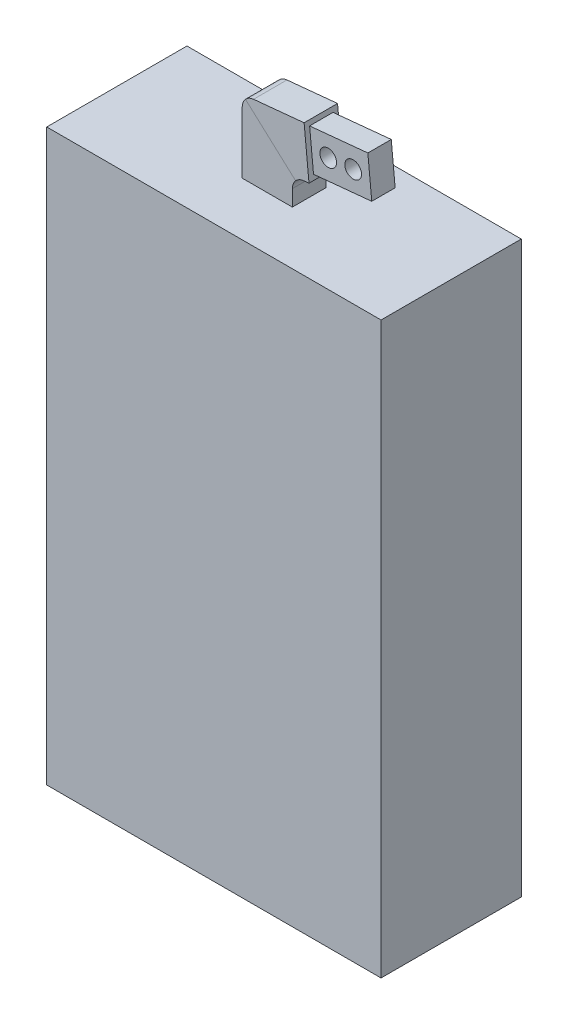
ISO-10303-21;
HEADER;
FILE_DESCRIPTION(('STEP AP214'),'2;1');
FILE_NAME('part.step','',(''),(''),'','','');
FILE_SCHEMA(('AUTOMOTIVE_DESIGN { 1 0 10303 214 1 1 1 1 }'));
ENDSEC;
DATA;
#1=APPLICATION_CONTEXT('core data for automotive mechanical design processes');
#2=APPLICATION_PROTOCOL_DEFINITION('international standard','automotive_design',2000,#1);
#3=PRODUCT_CONTEXT('',#1,'mechanical');
#4=PRODUCT('Part','Part','',(#3));
#5=PRODUCT_RELATED_PRODUCT_CATEGORY('part','',(#4));
#6=PRODUCT_DEFINITION_FORMATION('','',#4);
#7=PRODUCT_DEFINITION_CONTEXT('part definition',#1,'design');
#8=PRODUCT_DEFINITION('design','',#6,#7);
#9=PRODUCT_DEFINITION_SHAPE('','',#8);
#10=(LENGTH_UNIT() NAMED_UNIT(*) SI_UNIT(.MILLI.,.METRE.));
#11=(NAMED_UNIT(*) PLANE_ANGLE_UNIT() SI_UNIT($,.RADIAN.));
#12=(NAMED_UNIT(*) SI_UNIT($,.STERADIAN.) SOLID_ANGLE_UNIT());
#13=UNCERTAINTY_MEASURE_WITH_UNIT(LENGTH_MEASURE(1.E-05),#10,'distance_accuracy_value','');
#14=(GEOMETRIC_REPRESENTATION_CONTEXT(3) GLOBAL_UNCERTAINTY_ASSIGNED_CONTEXT((#13)) GLOBAL_UNIT_ASSIGNED_CONTEXT((#10,
#11,#12)) REPRESENTATION_CONTEXT('',''));
#15=CARTESIAN_POINT('',(0.,0.,0.));
#16=DIRECTION('',(0.,0.,1.));
#17=DIRECTION('',(1.,0.,0.));
#18=AXIS2_PLACEMENT_3D('',#15,#16,#17);
#19=CARTESIAN_POINT('',(-13.5365598552555,13.6060584518054,10.));
#20=DIRECTION('',(0.0972370244448278,-0.995261252675455,0.));
#21=DIRECTION('',(0.995261252675455,0.0972370244448278,0.));
#22=AXIS2_PLACEMENT_3D('',#19,#20,#21);
#23=PLANE('',#22);
#24=DIRECTION('',(0.995261252675455,0.0972370244448278,0.));
#25=VECTOR('',#24,1.);
#26=CARTESIAN_POINT('',(-13.5365598552555,13.6060584518054,10.));
#27=LINE('',#26,#25);
#28=CARTESIAN_POINT('',(21.7707223166638,17.0555799220749,10.));
#29=VERTEX_POINT('',#28);
#30=CARTESIAN_POINT('',(24.9526125280876,17.3664505959179,10.));
#31=VERTEX_POINT('',#30);
#32=EDGE_CURVE('E229',#29,#31,#27,.T.);
#33=ORIENTED_EDGE('',*,*,#32,.F.);
#34=DIRECTION('',(0.,0.,1.));
#35=VECTOR('',#34,1.);
#36=CARTESIAN_POINT('',(21.7707223166638,17.0555799220749,-10.));
#37=LINE('',#36,#35);
#38=CARTESIAN_POINT('',(21.7707223166638,17.0555799220749,-10.));
#39=VERTEX_POINT('',#38);
#40=EDGE_CURVE('E295',#29,#39,#37,.F.);
#41=ORIENTED_EDGE('',*,*,#40,.T.);
#42=DIRECTION('',(0.995261252675455,0.0972370244448278,0.));
#43=VECTOR('',#42,1.);
#44=CARTESIAN_POINT('',(-13.5365598552555,13.6060584518054,-10.));
#45=LINE('',#44,#43);
#46=CARTESIAN_POINT('',(24.9526125280876,17.3664505959179,-10.));
#47=VERTEX_POINT('',#46);
#48=EDGE_CURVE('E252',#39,#47,#45,.T.);
#49=ORIENTED_EDGE('',*,*,#48,.T.);
#50=DIRECTION('',(0.,0.,-1.));
#51=VECTOR('',#50,1.);
#52=CARTESIAN_POINT('',(24.9526125280876,17.3664505959179,10.));
#53=LINE('',#52,#51);
#54=EDGE_CURVE('E211',#31,#47,#53,.T.);
#55=ORIENTED_EDGE('',*,*,#54,.F.);
#56=EDGE_LOOP('',(#33,#41,#49,#55));
#57=FACE_BOUND('',#56,.T.);
#58=ADVANCED_FACE('F36',(#57),#23,.T.);
#59=CARTESIAN_POINT('',(-13.5365598552555,13.6060584518054,-10.));
#60=DIRECTION('',(0.,0.,-1.));
#61=DIRECTION('',(0.,1.,0.));
#62=AXIS2_PLACEMENT_3D('',#59,#60,#61);
#63=PLANE('',#62);
#64=DIRECTION('',(0.74068786423325,-0.671849304366378,0.));
#65=VECTOR('',#64,1.);
#66=CARTESIAN_POINT('',(23.158196473468,8.9940959716065,-10.));
#67=LINE('',#66,#65);
#68=CARTESIAN_POINT('',(-13.0551589817494,41.8418296070782,-10.));
#69=VERTEX_POINT('',#68);
#70=CARTESIAN_POINT('',(16.9448410182506,14.6299903097569,-10.));
#71=VERTEX_POINT('',#70);
#72=EDGE_CURVE('E50',#69,#71,#67,.T.);
#73=ORIENTED_EDGE('',*,*,#72,.F.);
#74=CARTESIAN_POINT('',(-7.5,36.8029598243303,-10.));
#75=DIRECTION('',(0.,0.,-1.));
#76=DIRECTION('',(0.,1.,0.));
#77=AXIS2_PLACEMENT_3D('',#74,#75,#76);
#78=CIRCLE('',#77,7.5);
#79=CARTESIAN_POINT('',(-8.2292776833362,44.2674192193962,-10.));
#80=VERTEX_POINT('',#79);
#81=EDGE_CURVE('E302',#69,#80,#78,.T.);
#82=ORIENTED_EDGE('',*,*,#81,.T.);
#83=DIRECTION('',(0.995261252675455,0.0972370244448278,0.));
#84=VECTOR('',#83,1.);
#85=CARTESIAN_POINT('',(-16.4536705886003,43.463896032069,-10.));
#86=LINE('',#85,#84);
#87=CARTESIAN_POINT('',(22.0355017947427,47.2242881761815,-10.));
#88=VERTEX_POINT('',#87);
#89=EDGE_CURVE('E250',#80,#88,#86,.T.);
#90=ORIENTED_EDGE('',*,*,#89,.T.);
#91=DIRECTION('',(-0.097237024444828,0.995261252675455,0.));
#92=VECTOR('',#91,1.);
#93=CARTESIAN_POINT('',(22.0355017947427,47.2242881761815,-10.));
#94=LINE('',#93,#92);
#95=EDGE_CURVE('E214',#47,#88,#94,.T.);
#96=ORIENTED_EDGE('',*,*,#95,.F.);
#97=ORIENTED_EDGE('',*,*,#48,.F.);
#98=CARTESIAN_POINT('',(22.5,9.59112052700902,-10.));
#99=DIRECTION('',(0.,0.,-1.));
#100=DIRECTION('',(0.,1.,0.));
#101=AXIS2_PLACEMENT_3D('',#98,#99,#100);
#102=CIRCLE('',#101,7.5);
#103=EDGE_CURVE('E44',#39,#71,#102,.F.);
#104=ORIENTED_EDGE('',*,*,#103,.T.);
#105=EDGE_LOOP('',(#73,#82,#90,#96,#97,#104));
#106=FACE_BOUND('',#105,.T.);
#107=ADVANCED_FACE('F317',(#106),#63,.T.);
#108=CARTESIAN_POINT('',(-16.4536705886003,43.463896032069,10.));
#109=DIRECTION('',(-0.0972370244448278,0.995261252675455,0.));
#110=DIRECTION('',(-0.995261252675455,-0.0972370244448278,0.));
#111=AXIS2_PLACEMENT_3D('',#108,#109,#110);
#112=PLANE('',#111);
#113=ORIENTED_EDGE('',*,*,#89,.F.);
#114=DIRECTION('',(0.,0.,-1.));
#115=VECTOR('',#114,1.);
#116=CARTESIAN_POINT('',(-8.2292776833362,44.2674192193962,10.));
#117=LINE('',#116,#115);
#118=CARTESIAN_POINT('',(-8.2292776833362,44.2674192193962,10.));
#119=VERTEX_POINT('',#118);
#120=EDGE_CURVE('E304',#80,#119,#117,.F.);
#121=ORIENTED_EDGE('',*,*,#120,.T.);
#122=DIRECTION('',(0.995261252675455,0.0972370244448278,0.));
#123=VECTOR('',#122,1.);
#124=CARTESIAN_POINT('',(-16.4536705886003,43.463896032069,10.));
#125=LINE('',#124,#123);
#126=CARTESIAN_POINT('',(22.0355017947427,47.2242881761815,10.));
#127=VERTEX_POINT('',#126);
#128=EDGE_CURVE('E220',#119,#127,#125,.T.);
#129=ORIENTED_EDGE('',*,*,#128,.T.);
#130=DIRECTION('',(0.,0.,1.));
#131=VECTOR('',#130,1.);
#132=CARTESIAN_POINT('',(22.0355017947427,47.2242881761815,10.));
#133=LINE('',#132,#131);
#134=EDGE_CURVE('E217',#88,#127,#133,.T.);
#135=ORIENTED_EDGE('',*,*,#134,.F.);
#136=EDGE_LOOP('',(#113,#121,#129,#135));
#137=FACE_BOUND('',#136,.T.);
#138=ADVANCED_FACE('F346',(#137),#112,.T.);
#139=CARTESIAN_POINT('',(-13.5365598552555,13.6060584518054,10.));
#140=DIRECTION('',(0.,0.,1.));
#141=DIRECTION('',(0.,-1.,0.));
#142=AXIS2_PLACEMENT_3D('',#139,#140,#141);
#143=PLANE('',#142);
#144=ORIENTED_EDGE('',*,*,#128,.F.);
#145=CARTESIAN_POINT('',(-7.5,36.8029598243303,10.));
#146=DIRECTION('',(0.,0.,1.));
#147=DIRECTION('',(0.,-1.,0.));
#148=AXIS2_PLACEMENT_3D('',#145,#146,#147);
#149=CIRCLE('',#148,7.5);
#150=CARTESIAN_POINT('',(-13.0551589817494,41.8418296070782,10.));
#151=VERTEX_POINT('',#150);
#152=EDGE_CURVE('E306',#119,#151,#149,.T.);
#153=ORIENTED_EDGE('',*,*,#152,.T.);
#154=DIRECTION('',(-0.74068786423325,0.671849304366378,0.));
#155=VECTOR('',#154,1.);
#156=CARTESIAN_POINT('',(23.158196473468,8.9940959716065,10.));
#157=LINE('',#156,#155);
#158=CARTESIAN_POINT('',(16.9448410182506,14.6299903097569,10.));
#159=VERTEX_POINT('',#158);
#160=EDGE_CURVE('E58',#159,#151,#157,.T.);
#161=ORIENTED_EDGE('',*,*,#160,.F.);
#162=CARTESIAN_POINT('',(22.5,9.59112052700902,10.));
#163=DIRECTION('',(0.,0.,1.));
#164=DIRECTION('',(0.,-1.,0.));
#165=AXIS2_PLACEMENT_3D('',#162,#163,#164);
#166=CIRCLE('',#165,7.5);
#167=EDGE_CURVE('E312',#159,#29,#166,.F.);
#168=ORIENTED_EDGE('',*,*,#167,.T.);
#169=ORIENTED_EDGE('',*,*,#32,.T.);
#170=DIRECTION('',(0.097237024444828,-0.995261252675455,0.));
#171=VECTOR('',#170,1.);
#172=CARTESIAN_POINT('',(22.0355017947427,47.2242881761815,10.));
#173=LINE('',#172,#171);
#174=EDGE_CURVE('E205',#127,#31,#173,.T.);
#175=ORIENTED_EDGE('',*,*,#174,.F.);
#176=EDGE_LOOP('',(#144,#153,#161,#168,#169,#175));
#177=FACE_BOUND('',#176,.T.);
#178=ADVANCED_FACE('F350',(#177),#143,.T.);
#179=CARTESIAN_POINT('',(-100.,-340.92,41.945));
#180=DIRECTION('',(-1.,0.,0.));
#181=DIRECTION('',(0.,0.,1.));
#182=AXIS2_PLACEMENT_3D('',#179,#180,#181);
#183=PLANE('',#182);
#184=DIRECTION('',(0.,0.,1.));
#185=VECTOR('',#184,1.);
#186=CARTESIAN_POINT('',(-100.,0.,41.945));
#187=LINE('',#186,#185);
#188=CARTESIAN_POINT('',(-100.,0.,-41.945));
#189=VERTEX_POINT('',#188);
#190=CARTESIAN_POINT('',(-100.,0.,41.945));
#191=VERTEX_POINT('',#190);
#192=EDGE_CURVE('E222',#189,#191,#187,.T.);
#193=ORIENTED_EDGE('',*,*,#192,.F.);
#194=DIRECTION('',(0.,1.,0.));
#195=VECTOR('',#194,1.);
#196=CARTESIAN_POINT('',(-100.,-340.92,-41.945));
#197=LINE('',#196,#195);
#198=CARTESIAN_POINT('',(-100.,-340.92,-41.945));
#199=VERTEX_POINT('',#198);
#200=EDGE_CURVE('E279',#199,#189,#197,.T.);
#201=ORIENTED_EDGE('',*,*,#200,.F.);
#202=DIRECTION('',(0.,0.,1.));
#203=VECTOR('',#202,1.);
#204=CARTESIAN_POINT('',(-100.,-340.92,41.945));
#205=LINE('',#204,#203);
#206=CARTESIAN_POINT('',(-100.,-340.92,41.945));
#207=VERTEX_POINT('',#206);
#208=EDGE_CURVE('E255',#199,#207,#205,.T.);
#209=ORIENTED_EDGE('',*,*,#208,.T.);
#210=DIRECTION('',(0.,1.,0.));
#211=VECTOR('',#210,1.);
#212=CARTESIAN_POINT('',(-100.,-340.92,41.945));
#213=LINE('',#212,#211);
#214=EDGE_CURVE('E268',#207,#191,#213,.T.);
#215=ORIENTED_EDGE('',*,*,#214,.T.);
#216=EDGE_LOOP('',(#193,#201,#209,#215));
#217=FACE_BOUND('',#216,.T.);
#218=ADVANCED_FACE('F367',(#217),#183,.T.);
#219=CARTESIAN_POINT('',(100.,-340.92,-41.945));
#220=DIRECTION('',(0.,0.,-1.));
#221=DIRECTION('',(-1.,0.,0.));
#222=AXIS2_PLACEMENT_3D('',#219,#220,#221);
#223=PLANE('',#222);
#224=DIRECTION('',(-1.,0.,0.));
#225=VECTOR('',#224,1.);
#226=CARTESIAN_POINT('',(100.,0.,-41.945));
#227=LINE('',#226,#225);
#228=CARTESIAN_POINT('',(100.,0.,-41.945));
#229=VERTEX_POINT('',#228);
#230=EDGE_CURVE('E259',#229,#189,#227,.T.);
#231=ORIENTED_EDGE('',*,*,#230,.F.);
#232=DIRECTION('',(0.,1.,0.));
#233=VECTOR('',#232,1.);
#234=CARTESIAN_POINT('',(100.,-340.92,-41.945));
#235=LINE('',#234,#233);
#236=CARTESIAN_POINT('',(100.,-340.92,-41.945));
#237=VERTEX_POINT('',#236);
#238=EDGE_CURVE('E282',#237,#229,#235,.T.);
#239=ORIENTED_EDGE('',*,*,#238,.F.);
#240=DIRECTION('',(-1.,0.,0.));
#241=VECTOR('',#240,1.);
#242=CARTESIAN_POINT('',(100.,-340.92,-41.945));
#243=LINE('',#242,#241);
#244=EDGE_CURVE('E265',#237,#199,#243,.T.);
#245=ORIENTED_EDGE('',*,*,#244,.T.);
#246=ORIENTED_EDGE('',*,*,#200,.T.);
#247=EDGE_LOOP('',(#231,#239,#245,#246));
#248=FACE_BOUND('',#247,.T.);
#249=ADVANCED_FACE('F380',(#248),#223,.T.);
#250=CARTESIAN_POINT('',(100.,-340.92,41.945));
#251=DIRECTION('',(1.,0.,0.));
#252=DIRECTION('',(0.,0.,-1.));
#253=AXIS2_PLACEMENT_3D('',#250,#251,#252);
#254=PLANE('',#253);
#255=DIRECTION('',(0.,0.,-1.));
#256=VECTOR('',#255,1.);
#257=CARTESIAN_POINT('',(100.,0.,41.945));
#258=LINE('',#257,#256);
#259=CARTESIAN_POINT('',(100.,0.,41.945));
#260=VERTEX_POINT('',#259);
#261=EDGE_CURVE('E274',#260,#229,#258,.T.);
#262=ORIENTED_EDGE('',*,*,#261,.F.);
#263=DIRECTION('',(0.,1.,0.));
#264=VECTOR('',#263,1.);
#265=CARTESIAN_POINT('',(100.,-340.92,41.945));
#266=LINE('',#265,#264);
#267=CARTESIAN_POINT('',(100.,-340.92,41.945));
#268=VERTEX_POINT('',#267);
#269=EDGE_CURVE('E284',#268,#260,#266,.T.);
#270=ORIENTED_EDGE('',*,*,#269,.F.);
#271=DIRECTION('',(0.,0.,-1.));
#272=VECTOR('',#271,1.);
#273=CARTESIAN_POINT('',(100.,-340.92,41.945));
#274=LINE('',#273,#272);
#275=EDGE_CURVE('E262',#268,#237,#274,.T.);
#276=ORIENTED_EDGE('',*,*,#275,.T.);
#277=ORIENTED_EDGE('',*,*,#238,.T.);
#278=EDGE_LOOP('',(#262,#270,#276,#277));
#279=FACE_BOUND('',#278,.T.);
#280=ADVANCED_FACE('F383',(#279),#254,.T.);
#281=CARTESIAN_POINT('',(100.,-340.92,41.945));
#282=DIRECTION('',(0.,0.,1.));
#283=DIRECTION('',(1.,0.,0.));
#284=AXIS2_PLACEMENT_3D('',#281,#282,#283);
#285=PLANE('',#284);
#286=DIRECTION('',(1.,0.,0.));
#287=VECTOR('',#286,1.);
#288=CARTESIAN_POINT('',(100.,0.,41.945));
#289=LINE('',#288,#287);
#290=EDGE_CURVE('E271',#191,#260,#289,.T.);
#291=ORIENTED_EDGE('',*,*,#290,.F.);
#292=ORIENTED_EDGE('',*,*,#214,.F.);
#293=DIRECTION('',(1.,0.,0.));
#294=VECTOR('',#293,1.);
#295=CARTESIAN_POINT('',(100.,-340.92,41.945));
#296=LINE('',#295,#294);
#297=EDGE_CURVE('E258',#207,#268,#296,.T.);
#298=ORIENTED_EDGE('',*,*,#297,.T.);
#299=ORIENTED_EDGE('',*,*,#269,.T.);
#300=EDGE_LOOP('',(#291,#292,#298,#299));
#301=FACE_BOUND('',#300,.T.);
#302=ADVANCED_FACE('F376',(#301),#285,.T.);
#303=CARTESIAN_POINT('',(0.,-340.92,0.));
#304=DIRECTION('',(0.,1.,0.));
#305=DIRECTION('',(0.,0.,1.));
#306=AXIS2_PLACEMENT_3D('',#303,#304,#305);
#307=PLANE('',#306);
#308=ORIENTED_EDGE('',*,*,#208,.F.);
#309=ORIENTED_EDGE('',*,*,#244,.F.);
#310=ORIENTED_EDGE('',*,*,#275,.F.);
#311=ORIENTED_EDGE('',*,*,#297,.F.);
#312=EDGE_LOOP('',(#308,#309,#310,#311));
#313=FACE_BOUND('',#312,.T.);
#314=ADVANCED_FACE('F373',(#313),#307,.F.);
#315=CARTESIAN_POINT('',(0.,0.,0.));
#316=DIRECTION('',(0.,1.,0.));
#317=DIRECTION('',(0.,0.,1.));
#318=AXIS2_PLACEMENT_3D('',#315,#316,#317);
#319=PLANE('',#318);
#320=DIRECTION('',(0.,0.,1.));
#321=VECTOR('',#320,1.);
#322=CARTESIAN_POINT('',(-15.,0.,10.));
#323=LINE('',#322,#321);
#324=CARTESIAN_POINT('',(-15.,0.,-10.));
#325=VERTEX_POINT('',#324);
#326=CARTESIAN_POINT('',(-15.,0.,10.));
#327=VERTEX_POINT('',#326);
#328=EDGE_CURVE('E240',#325,#327,#323,.T.);
#329=ORIENTED_EDGE('',*,*,#328,.F.);
#330=DIRECTION('',(-1.,0.,0.));
#331=VECTOR('',#330,1.);
#332=CARTESIAN_POINT('',(15.,0.,-10.));
#333=LINE('',#332,#331);
#334=CARTESIAN_POINT('',(15.,0.,-10.));
#335=VERTEX_POINT('',#334);
#336=EDGE_CURVE('E228',#335,#325,#333,.T.);
#337=ORIENTED_EDGE('',*,*,#336,.F.);
#338=DIRECTION('',(0.,0.,-1.));
#339=VECTOR('',#338,1.);
#340=CARTESIAN_POINT('',(15.,0.,10.));
#341=LINE('',#340,#339);
#342=CARTESIAN_POINT('',(15.,0.,10.));
#343=VERTEX_POINT('',#342);
#344=EDGE_CURVE('E225',#343,#335,#341,.T.);
#345=ORIENTED_EDGE('',*,*,#344,.F.);
#346=DIRECTION('',(1.,0.,0.));
#347=VECTOR('',#346,1.);
#348=CARTESIAN_POINT('',(15.,0.,10.));
#349=LINE('',#348,#347);
#350=EDGE_CURVE('E237',#327,#343,#349,.T.);
#351=ORIENTED_EDGE('',*,*,#350,.F.);
#352=EDGE_LOOP('',(#329,#337,#345,#351));
#353=FACE_BOUND('',#352,.T.);
#354=ORIENTED_EDGE('',*,*,#192,.T.);
#355=ORIENTED_EDGE('',*,*,#290,.T.);
#356=ORIENTED_EDGE('',*,*,#261,.T.);
#357=ORIENTED_EDGE('',*,*,#230,.T.);
#358=EDGE_LOOP('',(#354,#355,#356,#357));
#359=FACE_BOUND('',#358,.T.);
#360=ADVANCED_FACE('F330',(#353,#359),#319,.T.);
#361=CARTESIAN_POINT('',(15.,0.,10.));
#362=DIRECTION('',(0.,0.,1.));
#363=DIRECTION('',(1.,0.,0.));
#364=AXIS2_PLACEMENT_3D('',#361,#362,#363);
#365=PLANE('',#364);
#366=ORIENTED_EDGE('',*,*,#160,.T.);
#367=CARTESIAN_POINT('',(-7.5,36.8029598243303,10.));
#368=DIRECTION('',(0.,0.,1.));
#369=DIRECTION('',(1.,0.,0.));
#370=AXIS2_PLACEMENT_3D('',#367,#368,#369);
#371=CIRCLE('',#370,7.5);
#372=CARTESIAN_POINT('',(-15.,36.8029598243303,10.));
#373=VERTEX_POINT('',#372);
#374=EDGE_CURVE('E308',#151,#373,#371,.T.);
#375=ORIENTED_EDGE('',*,*,#374,.T.);
#376=DIRECTION('',(0.,1.,0.));
#377=VECTOR('',#376,1.);
#378=CARTESIAN_POINT('',(-15.,0.,10.));
#379=LINE('',#378,#377);
#380=EDGE_CURVE('E224',#327,#373,#379,.T.);
#381=ORIENTED_EDGE('',*,*,#380,.F.);
#382=ORIENTED_EDGE('',*,*,#350,.T.);
#383=DIRECTION('',(0.,1.,0.));
#384=VECTOR('',#383,1.);
#385=CARTESIAN_POINT('',(15.,0.,10.));
#386=LINE('',#385,#384);
#387=CARTESIAN_POINT('',(15.,9.59112052700902,10.));
#388=VERTEX_POINT('',#387);
#389=EDGE_CURVE('E234',#343,#388,#386,.T.);
#390=ORIENTED_EDGE('',*,*,#389,.T.);
#391=CARTESIAN_POINT('',(22.5,9.59112052700902,10.));
#392=DIRECTION('',(0.,0.,1.));
#393=DIRECTION('',(1.,0.,0.));
#394=AXIS2_PLACEMENT_3D('',#391,#392,#393);
#395=CIRCLE('',#394,7.5);
#396=EDGE_CURVE('E310',#388,#159,#395,.F.);
#397=ORIENTED_EDGE('',*,*,#396,.T.);
#398=EDGE_LOOP('',(#366,#375,#381,#382,#390,#397));
#399=FACE_BOUND('',#398,.T.);
#400=ADVANCED_FACE('F334',(#399),#365,.T.);
#401=CARTESIAN_POINT('',(-15.,0.,10.));
#402=DIRECTION('',(-1.,0.,0.));
#403=DIRECTION('',(0.,0.,1.));
#404=AXIS2_PLACEMENT_3D('',#401,#402,#403);
#405=PLANE('',#404);
#406=ORIENTED_EDGE('',*,*,#380,.T.);
#407=DIRECTION('',(0.,0.,-1.));
#408=VECTOR('',#407,1.);
#409=CARTESIAN_POINT('',(-15.,36.8029598243303,10.));
#410=LINE('',#409,#408);
#411=CARTESIAN_POINT('',(-15.,36.8029598243303,-10.));
#412=VERTEX_POINT('',#411);
#413=EDGE_CURVE('E297',#373,#412,#410,.T.);
#414=ORIENTED_EDGE('',*,*,#413,.T.);
#415=DIRECTION('',(0.,1.,0.));
#416=VECTOR('',#415,1.);
#417=CARTESIAN_POINT('',(-15.,0.,-10.));
#418=LINE('',#417,#416);
#419=EDGE_CURVE('E233',#325,#412,#418,.T.);
#420=ORIENTED_EDGE('',*,*,#419,.F.);
#421=ORIENTED_EDGE('',*,*,#328,.T.);
#422=EDGE_LOOP('',(#406,#414,#420,#421));
#423=FACE_BOUND('',#422,.T.);
#424=ADVANCED_FACE('F338',(#423),#405,.T.);
#425=CARTESIAN_POINT('',(15.,0.,-10.));
#426=DIRECTION('',(0.,0.,-1.));
#427=DIRECTION('',(-1.,0.,0.));
#428=AXIS2_PLACEMENT_3D('',#425,#426,#427);
#429=PLANE('',#428);
#430=ORIENTED_EDGE('',*,*,#419,.T.);
#431=CARTESIAN_POINT('',(-7.5,36.8029598243303,-10.));
#432=DIRECTION('',(0.,0.,-1.));
#433=DIRECTION('',(-1.,0.,0.));
#434=AXIS2_PLACEMENT_3D('',#431,#432,#433);
#435=CIRCLE('',#434,7.5);
#436=EDGE_CURVE('E300',#412,#69,#435,.T.);
#437=ORIENTED_EDGE('',*,*,#436,.T.);
#438=ORIENTED_EDGE('',*,*,#72,.T.);
#439=CARTESIAN_POINT('',(22.5,9.59112052700902,-10.));
#440=DIRECTION('',(0.,0.,-1.));
#441=DIRECTION('',(-1.,0.,0.));
#442=AXIS2_PLACEMENT_3D('',#439,#440,#441);
#443=CIRCLE('',#442,7.5);
#444=CARTESIAN_POINT('',(15.,9.59112052700902,-10.));
#445=VERTEX_POINT('',#444);
#446=EDGE_CURVE('E11',#71,#445,#443,.F.);
#447=ORIENTED_EDGE('',*,*,#446,.T.);
#448=DIRECTION('',(0.,1.,0.));
#449=VECTOR('',#448,1.);
#450=CARTESIAN_POINT('',(15.,0.,-10.));
#451=LINE('',#450,#449);
#452=EDGE_CURVE('E230',#335,#445,#451,.T.);
#453=ORIENTED_EDGE('',*,*,#452,.F.);
#454=ORIENTED_EDGE('',*,*,#336,.T.);
#455=EDGE_LOOP('',(#430,#437,#438,#447,#453,#454));
#456=FACE_BOUND('',#455,.T.);
#457=ADVANCED_FACE('F325',(#456),#429,.T.);
#458=CARTESIAN_POINT('',(15.,0.,10.));
#459=DIRECTION('',(1.,0.,0.));
#460=DIRECTION('',(0.,0.,-1.));
#461=AXIS2_PLACEMENT_3D('',#458,#459,#460);
#462=PLANE('',#461);
#463=ORIENTED_EDGE('',*,*,#452,.T.);
#464=DIRECTION('',(0.,0.,1.));
#465=VECTOR('',#464,1.);
#466=CARTESIAN_POINT('',(15.,9.59112052700902,10.));
#467=LINE('',#466,#465);
#468=EDGE_CURVE('E281',#445,#388,#467,.T.);
#469=ORIENTED_EDGE('',*,*,#468,.T.);
#470=ORIENTED_EDGE('',*,*,#389,.F.);
#471=ORIENTED_EDGE('',*,*,#344,.T.);
#472=EDGE_LOOP('',(#463,#469,#470,#471));
#473=FACE_BOUND('',#472,.T.);
#474=ADVANCED_FACE('F327',(#473),#462,.T.);
#475=CARTESIAN_POINT('',(26.397344444077,2.57902055373623,0.));
#476=DIRECTION('',(0.995261252675455,0.097237024444828,0.));
#477=DIRECTION('',(-0.097237024444828,0.995261252675455,0.));
#478=AXIS2_PLACEMENT_3D('',#475,#476,#477);
#479=PLANE('',#478);
#480=DIRECTION('',(0.,0.,1.));
#481=VECTOR('',#480,1.);
#482=CARTESIAN_POINT('',(22.3272128680772,44.2385044181551,-7.00000000000001));
#483=LINE('',#482,#481);
#484=CARTESIAN_POINT('',(22.3272128680772,44.2385044181551,-7.00000000000001));
#485=VERTEX_POINT('',#484);
#486=CARTESIAN_POINT('',(22.3272128680772,44.2385044181551,7.));
#487=VERTEX_POINT('',#486);
#488=EDGE_CURVE('E172',#485,#487,#483,.T.);
#489=ORIENTED_EDGE('',*,*,#488,.F.);
#490=DIRECTION('',(-0.0972370244448279,0.995261252675455,0.));
#491=VECTOR('',#490,1.);
#492=CARTESIAN_POINT('',(24.6609014547531,20.3522343539442,-7.00000000000001));
#493=LINE('',#492,#491);
#494=CARTESIAN_POINT('',(24.6609014547531,20.3522343539442,-7.00000000000001));
#495=VERTEX_POINT('',#494);
#496=EDGE_CURVE('E182',#495,#485,#493,.T.);
#497=ORIENTED_EDGE('',*,*,#496,.F.);
#498=DIRECTION('',(0.,0.,-1.));
#499=VECTOR('',#498,1.);
#500=CARTESIAN_POINT('',(24.6609014547531,20.3522343539442,-7.00000000000001));
#501=LINE('',#500,#499);
#502=CARTESIAN_POINT('',(24.6609014547531,20.3522343539442,7.));
#503=VERTEX_POINT('',#502);
#504=EDGE_CURVE('E164',#503,#495,#501,.T.);
#505=ORIENTED_EDGE('',*,*,#504,.F.);
#506=DIRECTION('',(0.0972370244448279,-0.995261252675455,0.));
#507=VECTOR('',#506,1.);
#508=CARTESIAN_POINT('',(24.6609014547531,20.3522343539442,7.));
#509=LINE('',#508,#507);
#510=EDGE_CURVE('E179',#487,#503,#509,.T.);
#511=ORIENTED_EDGE('',*,*,#510,.F.);
#512=EDGE_LOOP('',(#489,#497,#505,#511));
#513=FACE_BOUND('',#512,.T.);
#514=ORIENTED_EDGE('',*,*,#174,.T.);
#515=ORIENTED_EDGE('',*,*,#54,.T.);
#516=ORIENTED_EDGE('',*,*,#95,.T.);
#517=ORIENTED_EDGE('',*,*,#134,.T.);
#518=EDGE_LOOP('',(#514,#515,#516,#517));
#519=FACE_BOUND('',#518,.T.);
#520=ADVANCED_FACE('F177',(#513,#519),#479,.T.);
#521=CARTESIAN_POINT('',(24.6609014547531,20.3522343539442,7.));
#522=DIRECTION('',(0.,0.,1.));
#523=DIRECTION('',(0.,-1.,0.));
#524=AXIS2_PLACEMENT_3D('',#521,#522,#523);
#525=PLANE('',#524);
#526=CARTESIAN_POINT('',(33.4466696881697,33.267739630498,7.));
#527=DIRECTION('',(0.,0.,1.));
#528=DIRECTION('',(1.,0.,0.));
#529=AXIS2_PLACEMENT_3D('',#526,#527,#528);
#530=CIRCLE('',#529,5.);
#531=CARTESIAN_POINT('',(38.4466696881697,33.267739630498,7.));
#532=VERTEX_POINT('',#531);
#533=EDGE_CURVE('E290',#532,#532,#530,.T.);
#534=ORIENTED_EDGE('',*,*,#533,.F.);
#535=EDGE_LOOP('',(#534));
#536=FACE_BOUND('',#535,.T.);
#537=CARTESIAN_POINT('',(48.3755884783015,34.7262949971704,7.));
#538=DIRECTION('',(0.,0.,1.));
#539=DIRECTION('',(1.,0.,0.));
#540=AXIS2_PLACEMENT_3D('',#537,#538,#539);
#541=CIRCLE('',#540,5.);
#542=CARTESIAN_POINT('',(53.3755884783015,34.7262949971704,7.));
#543=VERTEX_POINT('',#542);
#544=EDGE_CURVE('E193',#543,#543,#541,.T.);
#545=ORIENTED_EDGE('',*,*,#544,.F.);
#546=EDGE_LOOP('',(#545));
#547=FACE_BOUND('',#546,.T.);
#548=DIRECTION('',(0.0972370244448279,-0.995261252675455,0.));
#549=VECTOR('',#548,1.);
#550=CARTESIAN_POINT('',(59.495045298394,23.7555302095132,7.));
#551=LINE('',#550,#549);
#552=CARTESIAN_POINT('',(57.1613567117181,47.6418002737241,7.));
#553=VERTEX_POINT('',#552);
#554=CARTESIAN_POINT('',(59.495045298394,23.7555302095132,7.));
#555=VERTEX_POINT('',#554);
#556=EDGE_CURVE('E198',#553,#555,#551,.T.);
#557=ORIENTED_EDGE('',*,*,#556,.F.);
#558=DIRECTION('',(0.995261252675455,0.0972370244448277,0.));
#559=VECTOR('',#558,1.);
#560=CARTESIAN_POINT('',(22.3272128680772,44.2385044181551,7.));
#561=LINE('',#560,#559);
#562=EDGE_CURVE('E186',#487,#553,#561,.T.);
#563=ORIENTED_EDGE('',*,*,#562,.F.);
#564=ORIENTED_EDGE('',*,*,#510,.T.);
#565=DIRECTION('',(0.995261252675455,0.0972370244448277,0.));
#566=VECTOR('',#565,1.);
#567=CARTESIAN_POINT('',(24.6609014547531,20.3522343539442,7.));
#568=LINE('',#567,#566);
#569=EDGE_CURVE('E160',#503,#555,#568,.T.);
#570=ORIENTED_EDGE('',*,*,#569,.T.);
#571=EDGE_LOOP('',(#557,#563,#564,#570));
#572=FACE_BOUND('',#571,.T.);
#573=ADVANCED_FACE('F185',(#536,#547,#572),#525,.T.);
#574=CARTESIAN_POINT('',(22.3272128680772,44.2385044181551,-7.00000000000001));
#575=DIRECTION('',(-0.0972370244448277,0.995261252675455,0.));
#576=DIRECTION('',(-0.995261252675455,-0.0972370244448277,0.));
#577=AXIS2_PLACEMENT_3D('',#574,#575,#576);
#578=PLANE('',#577);
#579=DIRECTION('',(0.,0.,1.));
#580=VECTOR('',#579,1.);
#581=CARTESIAN_POINT('',(57.1613567117181,47.6418002737241,-7.00000000000001));
#582=LINE('',#581,#580);
#583=CARTESIAN_POINT('',(57.1613567117181,47.6418002737241,-7.00000000000001));
#584=VERTEX_POINT('',#583);
#585=EDGE_CURVE('E187',#584,#553,#582,.T.);
#586=ORIENTED_EDGE('',*,*,#585,.F.);
#587=DIRECTION('',(0.995261252675455,0.0972370244448277,0.));
#588=VECTOR('',#587,1.);
#589=CARTESIAN_POINT('',(22.3272128680772,44.2385044181551,-7.00000000000001));
#590=LINE('',#589,#588);
#591=EDGE_CURVE('E206',#485,#584,#590,.T.);
#592=ORIENTED_EDGE('',*,*,#591,.F.);
#593=ORIENTED_EDGE('',*,*,#488,.T.);
#594=ORIENTED_EDGE('',*,*,#562,.T.);
#595=EDGE_LOOP('',(#586,#592,#593,#594));
#596=FACE_BOUND('',#595,.T.);
#597=ADVANCED_FACE('F408',(#596),#578,.T.);
#598=CARTESIAN_POINT('',(24.6609014547531,20.3522343539442,-7.00000000000001));
#599=DIRECTION('',(0.,0.,-1.));
#600=DIRECTION('',(-1.,0.,0.));
#601=AXIS2_PLACEMENT_3D('',#598,#599,#600);
#602=PLANE('',#601);
#603=CARTESIAN_POINT('',(33.4466696881697,33.267739630498,-7.00000000000001));
#604=DIRECTION('',(0.,0.,-1.));
#605=DIRECTION('',(-1.,0.,0.));
#606=AXIS2_PLACEMENT_3D('',#603,#604,#605);
#607=CIRCLE('',#606,5.);
#608=CARTESIAN_POINT('',(28.4466696881697,33.267739630498,-7.00000000000001));
#609=VERTEX_POINT('',#608);
#610=EDGE_CURVE('E200',#609,#609,#607,.T.);
#611=ORIENTED_EDGE('',*,*,#610,.F.);
#612=EDGE_LOOP('',(#611));
#613=FACE_BOUND('',#612,.T.);
#614=CARTESIAN_POINT('',(48.3755884783015,34.7262949971704,-7.00000000000001));
#615=DIRECTION('',(0.,0.,-1.));
#616=DIRECTION('',(-1.,0.,0.));
#617=AXIS2_PLACEMENT_3D('',#614,#615,#616);
#618=CIRCLE('',#617,5.);
#619=CARTESIAN_POINT('',(43.3755884783015,34.7262949971704,-7.00000000000001));
#620=VERTEX_POINT('',#619);
#621=EDGE_CURVE('E287',#620,#620,#618,.T.);
#622=ORIENTED_EDGE('',*,*,#621,.F.);
#623=EDGE_LOOP('',(#622));
#624=FACE_BOUND('',#623,.T.);
#625=DIRECTION('',(-0.0972370244448279,0.995261252675455,0.));
#626=VECTOR('',#625,1.);
#627=CARTESIAN_POINT('',(59.495045298394,23.7555302095132,-7.00000000000001));
#628=LINE('',#627,#626);
#629=CARTESIAN_POINT('',(59.495045298394,23.7555302095132,-7.00000000000001));
#630=VERTEX_POINT('',#629);
#631=EDGE_CURVE('E190',#630,#584,#628,.T.);
#632=ORIENTED_EDGE('',*,*,#631,.F.);
#633=DIRECTION('',(0.995261252675455,0.0972370244448277,0.));
#634=VECTOR('',#633,1.);
#635=CARTESIAN_POINT('',(24.6609014547531,20.3522343539442,-7.00000000000001));
#636=LINE('',#635,#634);
#637=EDGE_CURVE('E171',#495,#630,#636,.T.);
#638=ORIENTED_EDGE('',*,*,#637,.F.);
#639=ORIENTED_EDGE('',*,*,#496,.T.);
#640=ORIENTED_EDGE('',*,*,#591,.T.);
#641=EDGE_LOOP('',(#632,#638,#639,#640));
#642=FACE_BOUND('',#641,.T.);
#643=ADVANCED_FACE('F411',(#613,#624,#642),#602,.T.);
#644=CARTESIAN_POINT('',(24.6609014547531,20.3522343539442,-7.00000000000001));
#645=DIRECTION('',(0.0972370244448277,-0.995261252675455,0.));
#646=DIRECTION('',(0.995261252675455,0.0972370244448277,0.));
#647=AXIS2_PLACEMENT_3D('',#644,#645,#646);
#648=PLANE('',#647);
#649=DIRECTION('',(0.,0.,-1.));
#650=VECTOR('',#649,1.);
#651=CARTESIAN_POINT('',(59.495045298394,23.7555302095132,-7.00000000000001));
#652=LINE('',#651,#650);
#653=EDGE_CURVE('E166',#555,#630,#652,.T.);
#654=ORIENTED_EDGE('',*,*,#653,.F.);
#655=ORIENTED_EDGE('',*,*,#569,.F.);
#656=ORIENTED_EDGE('',*,*,#504,.T.);
#657=ORIENTED_EDGE('',*,*,#637,.T.);
#658=EDGE_LOOP('',(#654,#655,#656,#657));
#659=FACE_BOUND('',#658,.T.);
#660=ADVANCED_FACE('F162',(#659),#648,.T.);
#661=CARTESIAN_POINT('',(58.3282010050561,35.6986652416187,0.));
#662=DIRECTION('',(0.995261252675455,0.0972370244448277,0.));
#663=DIRECTION('',(0.,0.,1.));
#664=AXIS2_PLACEMENT_3D('',#661,#662,#663);
#665=PLANE('',#664);
#666=ORIENTED_EDGE('',*,*,#585,.T.);
#667=ORIENTED_EDGE('',*,*,#556,.T.);
#668=ORIENTED_EDGE('',*,*,#653,.T.);
#669=ORIENTED_EDGE('',*,*,#631,.T.);
#670=EDGE_LOOP('',(#666,#667,#668,#669));
#671=FACE_BOUND('',#670,.T.);
#672=ADVANCED_FACE('F368',(#671),#665,.T.);
#673=CARTESIAN_POINT('',(48.3755884783015,34.7262949971704,-41.945));
#674=DIRECTION('',(0.,0.,1.));
#675=DIRECTION('',(1.,0.,0.));
#676=AXIS2_PLACEMENT_3D('',#673,#674,#675);
#677=CYLINDRICAL_SURFACE('',#676,5.);
#678=ORIENTED_EDGE('',*,*,#621,.T.);
#679=EDGE_LOOP('',(#678));
#680=FACE_BOUND('',#679,.T.);
#681=ORIENTED_EDGE('',*,*,#544,.T.);
#682=EDGE_LOOP('',(#681));
#683=FACE_BOUND('',#682,.T.);
#684=ADVANCED_FACE('F371',(#680,#683),#677,.F.);
#685=CARTESIAN_POINT('',(33.4466696881697,33.267739630498,-41.945));
#686=DIRECTION('',(0.,0.,1.));
#687=DIRECTION('',(1.,0.,0.));
#688=AXIS2_PLACEMENT_3D('',#685,#686,#687);
#689=CYLINDRICAL_SURFACE('',#688,5.);
#690=ORIENTED_EDGE('',*,*,#610,.T.);
#691=EDGE_LOOP('',(#690));
#692=FACE_BOUND('',#691,.T.);
#693=ORIENTED_EDGE('',*,*,#533,.T.);
#694=EDGE_LOOP('',(#693));
#695=FACE_BOUND('',#694,.T.);
#696=ADVANCED_FACE('F394',(#692,#695),#689,.F.);
#697=CARTESIAN_POINT('',(22.5,9.59112052700902,10.));
#698=DIRECTION('',(0.,0.,-1.));
#699=DIRECTION('',(-1.,0.,0.));
#700=AXIS2_PLACEMENT_3D('',#697,#698,#699);
#701=CYLINDRICAL_SURFACE('',#700,7.5);
#702=ORIENTED_EDGE('',*,*,#103,.F.);
#703=ORIENTED_EDGE('',*,*,#40,.F.);
#704=ORIENTED_EDGE('',*,*,#167,.F.);
#705=ORIENTED_EDGE('',*,*,#396,.F.);
#706=ORIENTED_EDGE('',*,*,#468,.F.);
#707=ORIENTED_EDGE('',*,*,#446,.F.);
#708=EDGE_LOOP('',(#702,#703,#704,#705,#706,#707));
#709=FACE_BOUND('',#708,.T.);
#710=ADVANCED_FACE('F323',(#709),#701,.F.);
#711=CARTESIAN_POINT('',(-7.5,36.8029598243303,10.));
#712=DIRECTION('',(0.,0.,-1.));
#713=DIRECTION('',(-1.,0.,0.));
#714=AXIS2_PLACEMENT_3D('',#711,#712,#713);
#715=CYLINDRICAL_SURFACE('',#714,7.5);
#716=ORIENTED_EDGE('',*,*,#152,.F.);
#717=ORIENTED_EDGE('',*,*,#120,.F.);
#718=ORIENTED_EDGE('',*,*,#81,.F.);
#719=ORIENTED_EDGE('',*,*,#436,.F.);
#720=ORIENTED_EDGE('',*,*,#413,.F.);
#721=ORIENTED_EDGE('',*,*,#374,.F.);
#722=EDGE_LOOP('',(#716,#717,#718,#719,#720,#721));
#723=FACE_BOUND('',#722,.T.);
#724=ADVANCED_FACE('F38',(#723),#715,.T.);
#725=CLOSED_SHELL('',(#58,#107,#138,#178,#218,#249,#280,#302,#314,#360,#400,#424,#457,#474,#520,
#573,#597,#643,#660,#672,#684,#696,#710,#724));
#726=MANIFOLD_SOLID_BREP('B2',#725);
#727=ADVANCED_BREP_SHAPE_REPRESENTATION('',(#18,#726),#14);
#728=SHAPE_DEFINITION_REPRESENTATION(#9,#727);
ENDSEC;
END-ISO-10303-21;
